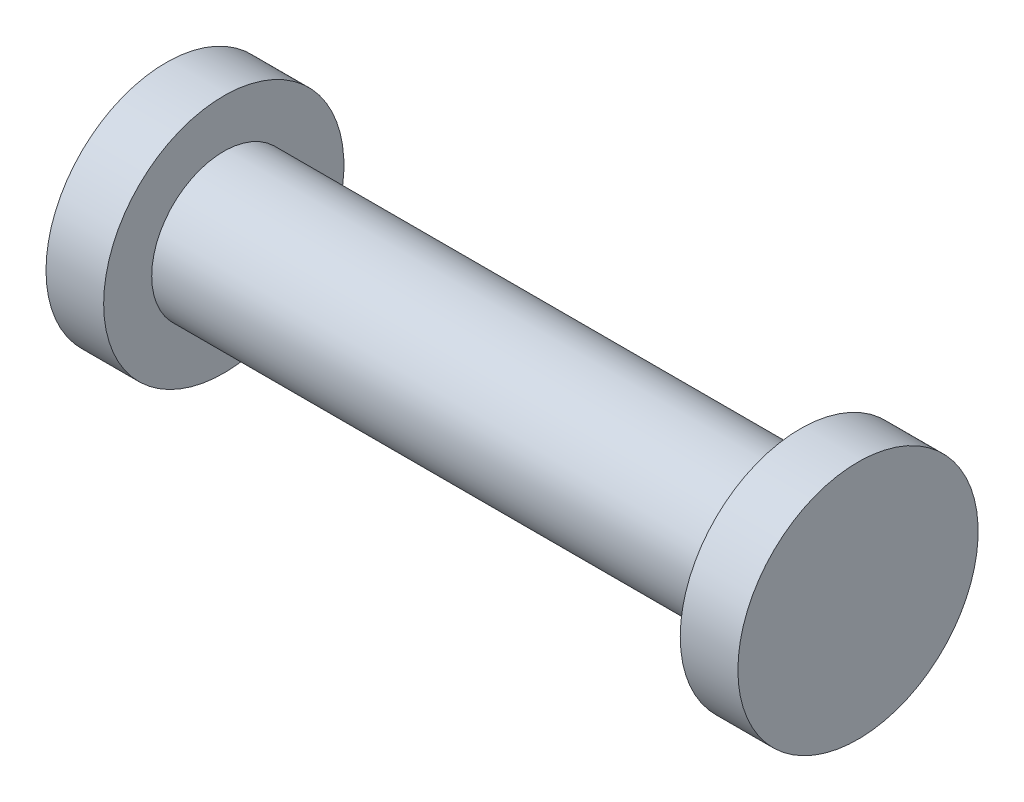
ISO-10303-21;
HEADER;
FILE_DESCRIPTION(('STEP AP214'),'2;1');
FILE_NAME('part.step','',(''),(''),'','','');
FILE_SCHEMA(('AUTOMOTIVE_DESIGN { 1 0 10303 214 1 1 1 1 }'));
ENDSEC;
DATA;
#1=APPLICATION_CONTEXT('core data for automotive mechanical design processes');
#2=APPLICATION_PROTOCOL_DEFINITION('international standard','automotive_design',2000,#1);
#3=PRODUCT_CONTEXT('',#1,'mechanical');
#4=PRODUCT('Part','Part','',(#3));
#5=PRODUCT_RELATED_PRODUCT_CATEGORY('part','',(#4));
#6=PRODUCT_DEFINITION_FORMATION('','',#4);
#7=PRODUCT_DEFINITION_CONTEXT('part definition',#1,'design');
#8=PRODUCT_DEFINITION('design','',#6,#7);
#9=PRODUCT_DEFINITION_SHAPE('','',#8);
#10=(LENGTH_UNIT() NAMED_UNIT(*) SI_UNIT(.MILLI.,.METRE.));
#11=(NAMED_UNIT(*) PLANE_ANGLE_UNIT() SI_UNIT($,.RADIAN.));
#12=(NAMED_UNIT(*) SI_UNIT($,.STERADIAN.) SOLID_ANGLE_UNIT());
#13=UNCERTAINTY_MEASURE_WITH_UNIT(LENGTH_MEASURE(1.E-05),#10,'distance_accuracy_value','');
#14=(GEOMETRIC_REPRESENTATION_CONTEXT(3) GLOBAL_UNCERTAINTY_ASSIGNED_CONTEXT((#13)) GLOBAL_UNIT_ASSIGNED_CONTEXT((#10,
#11,#12)) REPRESENTATION_CONTEXT('',''));
#15=CARTESIAN_POINT('',(0.,0.,0.));
#16=DIRECTION('',(0.,0.,1.));
#17=DIRECTION('',(1.,0.,0.));
#18=AXIS2_PLACEMENT_3D('',#15,#16,#17);
#19=CARTESIAN_POINT('',(36.,0.,-12.5));
#20=DIRECTION('',(-1.,0.,0.));
#21=DIRECTION('',(0.,0.,1.));
#22=AXIS2_PLACEMENT_3D('',#19,#20,#21);
#23=PLANE('',#22);
#24=CARTESIAN_POINT('',(36.,0.,0.));
#25=DIRECTION('',(-1.,0.,0.));
#26=DIRECTION('',(0.,0.,1.));
#27=AXIS2_PLACEMENT_3D('',#24,#25,#26);
#28=CIRCLE('',#27,12.5);
#29=CARTESIAN_POINT('',(36.,0.,12.5));
#30=VERTEX_POINT('',#29);
#31=EDGE_CURVE('E50',#30,#30,#28,.T.);
#32=ORIENTED_EDGE('',*,*,#31,.F.);
#33=EDGE_LOOP('',(#32));
#34=FACE_BOUND('',#33,.T.);
#35=ADVANCED_FACE('F28',(#34),#23,.F.);
#36=CARTESIAN_POINT('',(-36.,0.,0.));
#37=DIRECTION('',(1.,0.,0.));
#38=DIRECTION('',(0.,0.,-1.));
#39=AXIS2_PLACEMENT_3D('',#36,#37,#38);
#40=PLANE('',#39);
#41=CARTESIAN_POINT('',(-36.,0.,0.));
#42=DIRECTION('',(-1.,0.,0.));
#43=DIRECTION('',(0.,0.,1.));
#44=AXIS2_PLACEMENT_3D('',#41,#42,#43);
#45=CIRCLE('',#44,12.5);
#46=CARTESIAN_POINT('',(-36.,0.,12.5));
#47=VERTEX_POINT('',#46);
#48=EDGE_CURVE('E10',#47,#47,#45,.T.);
#49=ORIENTED_EDGE('',*,*,#48,.T.);
#50=EDGE_LOOP('',(#49));
#51=FACE_BOUND('',#50,.T.);
#52=ADVANCED_FACE('F57',(#51),#40,.F.);
#53=CARTESIAN_POINT('',(-414.016836438003,0.,0.));
#54=DIRECTION('',(-1.,0.,0.));
#55=DIRECTION('',(0.,0.,1.));
#56=AXIS2_PLACEMENT_3D('',#53,#54,#55);
#57=CYLINDRICAL_SURFACE('',#56,12.5);
#58=ORIENTED_EDGE('',*,*,#48,.F.);
#59=EDGE_LOOP('',(#58));
#60=FACE_BOUND('',#59,.T.);
#61=CARTESIAN_POINT('',(-30.,0.,0.));
#62=DIRECTION('',(-1.,0.,0.));
#63=DIRECTION('',(0.,0.,1.));
#64=AXIS2_PLACEMENT_3D('',#61,#62,#63);
#65=CIRCLE('',#64,12.5);
#66=CARTESIAN_POINT('',(-30.,0.,12.5));
#67=VERTEX_POINT('',#66);
#68=EDGE_CURVE('E34',#67,#67,#65,.T.);
#69=ORIENTED_EDGE('',*,*,#68,.T.);
#70=EDGE_LOOP('',(#69));
#71=FACE_BOUND('',#70,.T.);
#72=ADVANCED_FACE('F61',(#60,#71),#57,.T.);
#73=CARTESIAN_POINT('',(-30.,0.,-12.5));
#74=DIRECTION('',(-1.,0.,0.));
#75=DIRECTION('',(0.,0.,1.));
#76=AXIS2_PLACEMENT_3D('',#73,#74,#75);
#77=PLANE('',#76);
#78=ORIENTED_EDGE('',*,*,#68,.F.);
#79=EDGE_LOOP('',(#78));
#80=FACE_BOUND('',#79,.T.);
#81=CARTESIAN_POINT('',(-30.,0.,0.));
#82=DIRECTION('',(-1.,0.,0.));
#83=DIRECTION('',(0.,0.,1.));
#84=AXIS2_PLACEMENT_3D('',#81,#82,#83);
#85=CIRCLE('',#84,7.49999999999999);
#86=CARTESIAN_POINT('',(-30.,0.,7.49999999999999));
#87=VERTEX_POINT('',#86);
#88=EDGE_CURVE('E38',#87,#87,#85,.T.);
#89=ORIENTED_EDGE('',*,*,#88,.T.);
#90=EDGE_LOOP('',(#89));
#91=FACE_BOUND('',#90,.T.);
#92=ADVANCED_FACE('F65',(#80,#91),#77,.F.);
#93=CARTESIAN_POINT('',(-414.016836438003,0.,0.));
#94=DIRECTION('',(-1.,0.,0.));
#95=DIRECTION('',(0.,0.,1.));
#96=AXIS2_PLACEMENT_3D('',#93,#94,#95);
#97=CYLINDRICAL_SURFACE('',#96,7.49999999999999);
#98=ORIENTED_EDGE('',*,*,#88,.F.);
#99=EDGE_LOOP('',(#98));
#100=FACE_BOUND('',#99,.T.);
#101=CARTESIAN_POINT('',(30.,0.,0.));
#102=DIRECTION('',(-1.,0.,0.));
#103=DIRECTION('',(0.,0.,1.));
#104=AXIS2_PLACEMENT_3D('',#101,#102,#103);
#105=CIRCLE('',#104,7.49999999999999);
#106=CARTESIAN_POINT('',(30.,0.,7.49999999999999));
#107=VERTEX_POINT('',#106);
#108=EDGE_CURVE('E42',#107,#107,#105,.T.);
#109=ORIENTED_EDGE('',*,*,#108,.T.);
#110=EDGE_LOOP('',(#109));
#111=FACE_BOUND('',#110,.T.);
#112=ADVANCED_FACE('F71',(#100,#111),#97,.T.);
#113=CARTESIAN_POINT('',(30.,0.,-7.49999999999999));
#114=DIRECTION('',(1.,0.,0.));
#115=DIRECTION('',(0.,0.,-1.));
#116=AXIS2_PLACEMENT_3D('',#113,#114,#115);
#117=PLANE('',#116);
#118=ORIENTED_EDGE('',*,*,#108,.F.);
#119=EDGE_LOOP('',(#118));
#120=FACE_BOUND('',#119,.T.);
#121=CARTESIAN_POINT('',(30.,0.,0.));
#122=DIRECTION('',(-1.,0.,0.));
#123=DIRECTION('',(0.,0.,1.));
#124=AXIS2_PLACEMENT_3D('',#121,#122,#123);
#125=CIRCLE('',#124,12.5);
#126=CARTESIAN_POINT('',(30.,0.,12.5));
#127=VERTEX_POINT('',#126);
#128=EDGE_CURVE('E47',#127,#127,#125,.T.);
#129=ORIENTED_EDGE('',*,*,#128,.T.);
#130=EDGE_LOOP('',(#129));
#131=FACE_BOUND('',#130,.T.);
#132=ADVANCED_FACE('F75',(#120,#131),#117,.F.);
#133=CARTESIAN_POINT('',(-414.016836438003,0.,0.));
#134=DIRECTION('',(-1.,0.,0.));
#135=DIRECTION('',(0.,0.,1.));
#136=AXIS2_PLACEMENT_3D('',#133,#134,#135);
#137=CYLINDRICAL_SURFACE('',#136,12.5);
#138=ORIENTED_EDGE('',*,*,#128,.F.);
#139=EDGE_LOOP('',(#138));
#140=FACE_BOUND('',#139,.T.);
#141=ORIENTED_EDGE('',*,*,#31,.T.);
#142=EDGE_LOOP('',(#141));
#143=FACE_BOUND('',#142,.T.);
#144=ADVANCED_FACE('F54',(#140,#143),#137,.T.);
#145=CLOSED_SHELL('',(#35,#52,#72,#92,#112,#132,#144));
#146=MANIFOLD_SOLID_BREP('B2',#145);
#147=ADVANCED_BREP_SHAPE_REPRESENTATION('',(#18,#146),#14);
#148=SHAPE_DEFINITION_REPRESENTATION(#9,#147);
ENDSEC;
END-ISO-10303-21;
